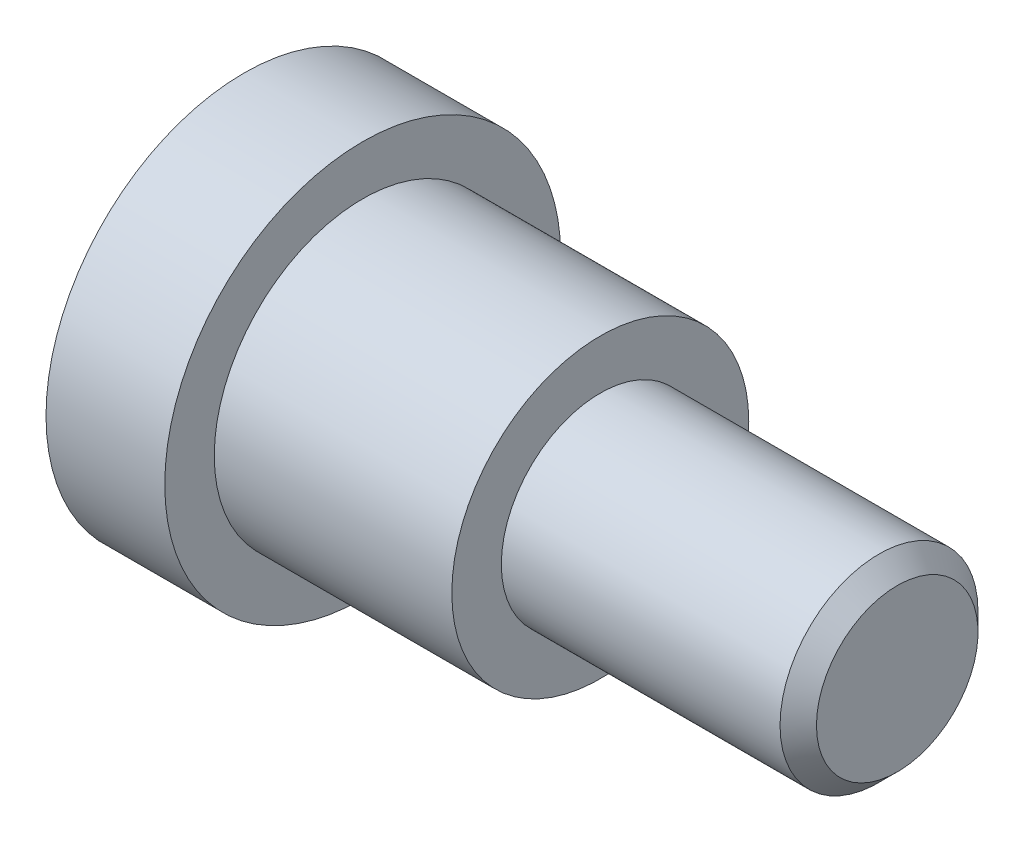
ISO-10303-21;
HEADER;
FILE_DESCRIPTION(('STEP AP214'),'2;1');
FILE_NAME('part.step','',(''),(''),'','','');
FILE_SCHEMA(('AUTOMOTIVE_DESIGN { 1 0 10303 214 1 1 1 1 }'));
ENDSEC;
DATA;
#1=APPLICATION_CONTEXT('core data for automotive mechanical design processes');
#2=APPLICATION_PROTOCOL_DEFINITION('international standard','automotive_design',2000,#1);
#3=PRODUCT_CONTEXT('',#1,'mechanical');
#4=PRODUCT('Part','Part','',(#3));
#5=PRODUCT_RELATED_PRODUCT_CATEGORY('part','',(#4));
#6=PRODUCT_DEFINITION_FORMATION('','',#4);
#7=PRODUCT_DEFINITION_CONTEXT('part definition',#1,'design');
#8=PRODUCT_DEFINITION('design','',#6,#7);
#9=PRODUCT_DEFINITION_SHAPE('','',#8);
#10=(LENGTH_UNIT() NAMED_UNIT(*) SI_UNIT(.MILLI.,.METRE.));
#11=(NAMED_UNIT(*) PLANE_ANGLE_UNIT() SI_UNIT($,.RADIAN.));
#12=(NAMED_UNIT(*) SI_UNIT($,.STERADIAN.) SOLID_ANGLE_UNIT());
#13=UNCERTAINTY_MEASURE_WITH_UNIT(LENGTH_MEASURE(1.E-05),#10,'distance_accuracy_value','');
#14=(GEOMETRIC_REPRESENTATION_CONTEXT(3) GLOBAL_UNCERTAINTY_ASSIGNED_CONTEXT((#13)) GLOBAL_UNIT_ASSIGNED_CONTEXT((#10,
#11,#12)) REPRESENTATION_CONTEXT('',''));
#15=CARTESIAN_POINT('',(0.,0.,0.));
#16=DIRECTION('',(0.,0.,1.));
#17=DIRECTION('',(1.,0.,0.));
#18=AXIS2_PLACEMENT_3D('',#15,#16,#17);
#19=CARTESIAN_POINT('',(27.,2.04,0.));
#20=DIRECTION('',(1.,0.,0.));
#21=DIRECTION('',(0.,0.,-1.));
#22=AXIS2_PLACEMENT_3D('',#19,#20,#21);
#23=PLANE('',#22);
#24=CARTESIAN_POINT('',(26.9999999999868,0.,0.));
#25=DIRECTION('',(-1.,0.,0.));
#26=DIRECTION('',(0.,0.,1.));
#27=AXIS2_PLACEMENT_3D('',#24,#25,#26);
#28=CIRCLE('',#27,4.07999999998765);
#29=CARTESIAN_POINT('',(26.9999999999868,0.,4.07999999998765));
#30=VERTEX_POINT('',#29);
#31=EDGE_CURVE('E20',#30,#30,#28,.T.);
#32=ORIENTED_EDGE('',*,*,#31,.F.);
#33=EDGE_LOOP('',(#32));
#34=FACE_BOUND('',#33,.T.);
#35=ADVANCED_FACE('F17',(#34),#23,.T.);
#36=CARTESIAN_POINT('',(26.0800000001495,0.,0.));
#37=DIRECTION('',(-1.,0.,0.));
#38=DIRECTION('',(0.,0.,1.));
#39=AXIS2_PLACEMENT_3D('',#36,#37,#38);
#40=CONICAL_SURFACE('',#39,4.99999999988177,0.785398163428342);
#41=CARTESIAN_POINT('',(26.08,0.,0.));
#42=DIRECTION('',(1.,0.,0.));
#43=DIRECTION('',(0.,0.,-1.));
#44=AXIS2_PLACEMENT_3D('',#41,#42,#43);
#45=CIRCLE('',#44,5.);
#46=CARTESIAN_POINT('',(26.08,0.,-5.));
#47=VERTEX_POINT('',#46);
#48=EDGE_CURVE('E160',#47,#47,#45,.F.);
#49=ORIENTED_EDGE('',*,*,#48,.F.);
#50=EDGE_LOOP('',(#49));
#51=FACE_BOUND('',#50,.T.);
#52=ORIENTED_EDGE('',*,*,#31,.T.);
#53=EDGE_LOOP('',(#52));
#54=FACE_BOUND('',#53,.T.);
#55=ADVANCED_FACE('F318',(#51,#54),#40,.T.);
#56=CARTESIAN_POINT('',(-1.5,0.,0.));
#57=DIRECTION('',(1.,0.,0.));
#58=DIRECTION('',(0.,0.,-1.));
#59=AXIS2_PLACEMENT_3D('',#56,#57,#58);
#60=PLANE('',#59);
#61=DIRECTION('',(0.,1.,0.));
#62=VECTOR('',#61,1.);
#63=CARTESIAN_POINT('',(-1.5,0.,-3.));
#64=LINE('',#63,#62);
#65=CARTESIAN_POINT('',(-1.5,-1.73205080756888,-3.));
#66=VERTEX_POINT('',#65);
#67=CARTESIAN_POINT('',(-1.49999999998226,0.,-2.99999999999295));
#68=VERTEX_POINT('',#67);
#69=EDGE_CURVE('E89',#66,#68,#64,.T.);
#70=ORIENTED_EDGE('',*,*,#69,.F.);
#71=DIRECTION('',(0.,0.500000000000001,-0.866025403784438));
#72=VECTOR('',#71,1.);
#73=CARTESIAN_POINT('',(-1.5,-2.59807621135332,-1.5));
#74=LINE('',#73,#72);
#75=CARTESIAN_POINT('',(-1.49999999998226,-2.59807621134721,-1.49999999999647));
#76=VERTEX_POINT('',#75);
#77=EDGE_CURVE('E111',#76,#66,#74,.T.);
#78=ORIENTED_EDGE('',*,*,#77,.F.);
#79=CARTESIAN_POINT('',(-1.49999999996453,0.,0.));
#80=DIRECTION('',(-1.,0.,0.));
#81=DIRECTION('',(0.,0.,1.));
#82=AXIS2_PLACEMENT_3D('',#79,#80,#81);
#83=CIRCLE('',#82,2.9999999999859);
#84=EDGE_CURVE('E118',#76,#68,#83,.F.);
#85=ORIENTED_EDGE('',*,*,#84,.T.);
#86=EDGE_LOOP('',(#70,#78,#85));
#87=FACE_BOUND('',#86,.T.);
#88=ADVANCED_FACE('F117',(#87),#60,.F.);
#89=CARTESIAN_POINT('',(-1.5,0.,0.));
#90=DIRECTION('',(1.,0.,0.));
#91=DIRECTION('',(0.,0.,-1.));
#92=AXIS2_PLACEMENT_3D('',#89,#90,#91);
#93=PLANE('',#92);
#94=DIRECTION('',(0.,0.500000000000001,0.866025403784438));
#95=VECTOR('',#94,1.);
#96=CARTESIAN_POINT('',(-1.5,1.73205080756888,-3.));
#97=LINE('',#96,#95);
#98=CARTESIAN_POINT('',(-1.5,1.73205080756888,-3.));
#99=VERTEX_POINT('',#98);
#100=CARTESIAN_POINT('',(-1.49999999998226,2.59807621134721,-1.49999999999647));
#101=VERTEX_POINT('',#100);
#102=EDGE_CURVE('E163',#99,#101,#97,.T.);
#103=ORIENTED_EDGE('',*,*,#102,.F.);
#104=DIRECTION('',(0.,1.,0.));
#105=VECTOR('',#104,1.);
#106=CARTESIAN_POINT('',(-1.5,0.,-3.));
#107=LINE('',#106,#105);
#108=EDGE_CURVE('E174',#68,#99,#107,.T.);
#109=ORIENTED_EDGE('',*,*,#108,.F.);
#110=CARTESIAN_POINT('',(-1.49999999996453,0.,0.));
#111=DIRECTION('',(-1.,0.,0.));
#112=DIRECTION('',(0.,0.,1.));
#113=AXIS2_PLACEMENT_3D('',#110,#111,#112);
#114=CIRCLE('',#113,2.9999999999859);
#115=EDGE_CURVE('E125',#68,#101,#114,.F.);
#116=ORIENTED_EDGE('',*,*,#115,.T.);
#117=EDGE_LOOP('',(#103,#109,#116));
#118=FACE_BOUND('',#117,.T.);
#119=ADVANCED_FACE('F312',(#118),#93,.F.);
#120=CARTESIAN_POINT('',(19.04,0.,0.));
#121=DIRECTION('',(1.,0.,0.));
#122=DIRECTION('',(0.,0.,-1.));
#123=AXIS2_PLACEMENT_3D('',#120,#121,#122);
#124=CYLINDRICAL_SURFACE('',#123,5.);
#125=CARTESIAN_POINT('',(12.,0.,0.));
#126=DIRECTION('',(1.,0.,0.));
#127=DIRECTION('',(0.,0.,-1.));
#128=AXIS2_PLACEMENT_3D('',#125,#126,#127);
#129=CIRCLE('',#128,5.);
#130=CARTESIAN_POINT('',(12.,0.,-5.));
#131=VERTEX_POINT('',#130);
#132=EDGE_CURVE('E127',#131,#131,#129,.F.);
#133=ORIENTED_EDGE('',*,*,#132,.F.);
#134=EDGE_LOOP('',(#133));
#135=FACE_BOUND('',#134,.T.);
#136=ORIENTED_EDGE('',*,*,#48,.T.);
#137=EDGE_LOOP('',(#136));
#138=FACE_BOUND('',#137,.T.);
#139=ADVANCED_FACE('F309',(#135,#138),#124,.T.);
#140=CARTESIAN_POINT('',(-1.5,0.,0.));
#141=DIRECTION('',(1.,0.,0.));
#142=DIRECTION('',(0.,0.,-1.));
#143=AXIS2_PLACEMENT_3D('',#140,#141,#142);
#144=PLANE('',#143);
#145=DIRECTION('',(0.,1.,0.));
#146=VECTOR('',#145,1.);
#147=CARTESIAN_POINT('',(-1.5,0.,3.));
#148=LINE('',#147,#146);
#149=CARTESIAN_POINT('',(-1.5,1.73205080756888,3.));
#150=VERTEX_POINT('',#149);
#151=CARTESIAN_POINT('',(-1.49999999998226,0.,2.99999999999295));
#152=VERTEX_POINT('',#151);
#153=EDGE_CURVE('E126',#150,#152,#148,.F.);
#154=ORIENTED_EDGE('',*,*,#153,.F.);
#155=DIRECTION('',(0.,-0.500000000000001,0.866025403784438));
#156=VECTOR('',#155,1.);
#157=CARTESIAN_POINT('',(-1.5,2.59807621135332,1.5));
#158=LINE('',#157,#156);
#159=CARTESIAN_POINT('',(-1.49999999998226,2.59807621134721,1.49999999999647));
#160=VERTEX_POINT('',#159);
#161=EDGE_CURVE('E129',#160,#150,#158,.T.);
#162=ORIENTED_EDGE('',*,*,#161,.F.);
#163=CARTESIAN_POINT('',(-1.49999999996453,0.,0.));
#164=DIRECTION('',(-1.,0.,0.));
#165=DIRECTION('',(0.,0.,1.));
#166=AXIS2_PLACEMENT_3D('',#163,#164,#165);
#167=CIRCLE('',#166,2.9999999999859);
#168=EDGE_CURVE('E105',#160,#152,#167,.F.);
#169=ORIENTED_EDGE('',*,*,#168,.T.);
#170=EDGE_LOOP('',(#154,#162,#169));
#171=FACE_BOUND('',#170,.T.);
#172=ADVANCED_FACE('F243',(#171),#144,.F.);
#173=CARTESIAN_POINT('',(12.,3.75,0.));
#174=DIRECTION('',(1.,0.,0.));
#175=DIRECTION('',(0.,0.,-1.));
#176=AXIS2_PLACEMENT_3D('',#173,#174,#175);
#177=PLANE('',#176);
#178=CARTESIAN_POINT('',(12.,0.,0.));
#179=DIRECTION('',(1.,0.,0.));
#180=DIRECTION('',(0.,0.,-1.));
#181=AXIS2_PLACEMENT_3D('',#178,#179,#180);
#182=CIRCLE('',#181,7.5);
#183=CARTESIAN_POINT('',(12.,0.,-7.5));
#184=VERTEX_POINT('',#183);
#185=EDGE_CURVE('E104',#184,#184,#182,.F.);
#186=ORIENTED_EDGE('',*,*,#185,.F.);
#187=EDGE_LOOP('',(#186));
#188=FACE_BOUND('',#187,.T.);
#189=ORIENTED_EDGE('',*,*,#132,.T.);
#190=EDGE_LOOP('',(#189));
#191=FACE_BOUND('',#190,.T.);
#192=ADVANCED_FACE('F303',(#188,#191),#177,.T.);
#193=CARTESIAN_POINT('',(-1.49999999996453,0.,0.));
#194=DIRECTION('',(-1.,0.,0.));
#195=DIRECTION('',(0.,0.,1.));
#196=AXIS2_PLACEMENT_3D('',#193,#194,#195);
#197=CONICAL_SURFACE('',#196,2.9999999999859,1.04719755119645);
#198=CARTESIAN_POINT('',(-1.49999999996453,0.,0.));
#199=DIRECTION('',(-1.,0.,0.));
#200=DIRECTION('',(0.,0.,1.));
#201=AXIS2_PLACEMENT_3D('',#198,#199,#200);
#202=CIRCLE('',#201,2.9999999999859);
#203=EDGE_CURVE('E134',#101,#160,#202,.F.);
#204=ORIENTED_EDGE('',*,*,#203,.F.);
#205=ORIENTED_EDGE('',*,*,#115,.F.);
#206=ORIENTED_EDGE('',*,*,#84,.F.);
#207=CARTESIAN_POINT('',(-1.49999999996453,0.,0.));
#208=DIRECTION('',(-1.,0.,0.));
#209=DIRECTION('',(0.,0.,1.));
#210=AXIS2_PLACEMENT_3D('',#207,#208,#209);
#211=CIRCLE('',#210,2.9999999999859);
#212=CARTESIAN_POINT('',(-1.49999999998226,-2.59807621134721,1.49999999999647));
#213=VERTEX_POINT('',#212);
#214=EDGE_CURVE('E94',#213,#76,#211,.F.);
#215=ORIENTED_EDGE('',*,*,#214,.F.);
#216=CARTESIAN_POINT('',(-1.49999999996453,0.,0.));
#217=DIRECTION('',(-1.,0.,0.));
#218=DIRECTION('',(0.,0.,1.));
#219=AXIS2_PLACEMENT_3D('',#216,#217,#218);
#220=CIRCLE('',#219,2.9999999999859);
#221=EDGE_CURVE('E140',#213,#152,#220,.T.);
#222=ORIENTED_EDGE('',*,*,#221,.T.);
#223=ORIENTED_EDGE('',*,*,#168,.F.);
#224=EDGE_LOOP('',(#204,#205,#206,#215,#222,#223));
#225=FACE_BOUND('',#224,.T.);
#226=CARTESIAN_POINT('',(0.232050807625228,2.8421709430404E-11,0.));
#227=VERTEX_POINT('',#226);
#228=VERTEX_LOOP('',#227);
#229=FACE_BOUND('',#228,.T.);
#230=ADVANCED_FACE('F122',(#225,#229),#197,.F.);
#231=CARTESIAN_POINT('',(6.,0.,0.));
#232=DIRECTION('',(1.,0.,0.));
#233=DIRECTION('',(0.,0.,-1.));
#234=AXIS2_PLACEMENT_3D('',#231,#232,#233);
#235=CYLINDRICAL_SURFACE('',#234,7.5);
#236=CARTESIAN_POINT('',(0.,0.,0.));
#237=DIRECTION('',(1.,0.,0.));
#238=DIRECTION('',(0.,0.,-1.));
#239=AXIS2_PLACEMENT_3D('',#236,#237,#238);
#240=CIRCLE('',#239,7.5);
#241=CARTESIAN_POINT('',(0.,0.,-7.5));
#242=VERTEX_POINT('',#241);
#243=EDGE_CURVE('E142',#242,#242,#240,.F.);
#244=ORIENTED_EDGE('',*,*,#243,.F.);
#245=EDGE_LOOP('',(#244));
#246=FACE_BOUND('',#245,.T.);
#247=ORIENTED_EDGE('',*,*,#185,.T.);
#248=EDGE_LOOP('',(#247));
#249=FACE_BOUND('',#248,.T.);
#250=ADVANCED_FACE('F297',(#246,#249),#235,.T.);
#251=CARTESIAN_POINT('',(-1.5,0.,0.));
#252=DIRECTION('',(1.,0.,0.));
#253=DIRECTION('',(0.,0.,-1.));
#254=AXIS2_PLACEMENT_3D('',#251,#252,#253);
#255=PLANE('',#254);
#256=DIRECTION('',(0.,-0.5,-0.866025403784439));
#257=VECTOR('',#256,1.);
#258=CARTESIAN_POINT('',(-1.5,-3.46410161513775,0.));
#259=LINE('',#258,#257);
#260=CARTESIAN_POINT('',(-1.5,-1.73205080756888,3.));
#261=VERTEX_POINT('',#260);
#262=EDGE_CURVE('E190',#213,#261,#259,.F.);
#263=ORIENTED_EDGE('',*,*,#262,.T.);
#264=DIRECTION('',(0.,1.,0.));
#265=VECTOR('',#264,1.);
#266=CARTESIAN_POINT('',(-1.5,-1.73205080756888,3.));
#267=LINE('',#266,#265);
#268=EDGE_CURVE('E145',#261,#152,#267,.T.);
#269=ORIENTED_EDGE('',*,*,#268,.T.);
#270=ORIENTED_EDGE('',*,*,#221,.F.);
#271=EDGE_LOOP('',(#263,#269,#270));
#272=FACE_BOUND('',#271,.T.);
#273=ADVANCED_FACE('F247',(#272),#255,.F.);
#274=CARTESIAN_POINT('',(-1.5,0.,0.));
#275=DIRECTION('',(1.,0.,0.));
#276=DIRECTION('',(0.,0.,-1.));
#277=AXIS2_PLACEMENT_3D('',#274,#275,#276);
#278=PLANE('',#277);
#279=DIRECTION('',(0.,0.5,-0.866025403784439));
#280=VECTOR('',#279,1.);
#281=CARTESIAN_POINT('',(-1.5,-1.73205080756888,-3.));
#282=LINE('',#281,#280);
#283=CARTESIAN_POINT('',(-1.5,-3.46410161513775,0.));
#284=VERTEX_POINT('',#283);
#285=EDGE_CURVE('E97',#76,#284,#282,.F.);
#286=ORIENTED_EDGE('',*,*,#285,.T.);
#287=DIRECTION('',(0.,-0.5,-0.866025403784439));
#288=VECTOR('',#287,1.);
#289=CARTESIAN_POINT('',(-1.5,-3.46410161513775,0.));
#290=LINE('',#289,#288);
#291=EDGE_CURVE('E99',#284,#213,#290,.F.);
#292=ORIENTED_EDGE('',*,*,#291,.T.);
#293=ORIENTED_EDGE('',*,*,#214,.T.);
#294=EDGE_LOOP('',(#286,#292,#293));
#295=FACE_BOUND('',#294,.T.);
#296=ADVANCED_FACE('F96',(#295),#278,.F.);
#297=CARTESIAN_POINT('',(-1.5,0.,0.));
#298=DIRECTION('',(1.,0.,0.));
#299=DIRECTION('',(0.,0.,-1.));
#300=AXIS2_PLACEMENT_3D('',#297,#298,#299);
#301=PLANE('',#300);
#302=DIRECTION('',(0.,-0.5,0.866025403784439));
#303=VECTOR('',#302,1.);
#304=CARTESIAN_POINT('',(-1.5,1.73205080756888,3.));
#305=LINE('',#304,#303);
#306=CARTESIAN_POINT('',(-1.5,3.46410161513775,0.));
#307=VERTEX_POINT('',#306);
#308=EDGE_CURVE('E168',#160,#307,#305,.F.);
#309=ORIENTED_EDGE('',*,*,#308,.T.);
#310=DIRECTION('',(0.,0.5,0.866025403784439));
#311=VECTOR('',#310,1.);
#312=CARTESIAN_POINT('',(-1.5,3.46410161513775,0.));
#313=LINE('',#312,#311);
#314=EDGE_CURVE('E154',#307,#101,#313,.F.);
#315=ORIENTED_EDGE('',*,*,#314,.T.);
#316=ORIENTED_EDGE('',*,*,#203,.T.);
#317=EDGE_LOOP('',(#309,#315,#316));
#318=FACE_BOUND('',#317,.T.);
#319=ADVANCED_FACE('F281',(#318),#301,.F.);
#320=CARTESIAN_POINT('',(0.,8.75,0.));
#321=DIRECTION('',(1.,0.,0.));
#322=DIRECTION('',(0.,0.,-1.));
#323=AXIS2_PLACEMENT_3D('',#320,#321,#322);
#324=PLANE('',#323);
#325=ORIENTED_EDGE('',*,*,#243,.T.);
#326=EDGE_LOOP('',(#325));
#327=FACE_BOUND('',#326,.T.);
#328=CARTESIAN_POINT('',(0.,0.,0.));
#329=DIRECTION('',(1.,0.,0.));
#330=DIRECTION('',(0.,0.,-1.));
#331=AXIS2_PLACEMENT_3D('',#328,#329,#330);
#332=CIRCLE('',#331,10.);
#333=CARTESIAN_POINT('',(0.,0.,-10.));
#334=VERTEX_POINT('',#333);
#335=EDGE_CURVE('E146',#334,#334,#332,.F.);
#336=ORIENTED_EDGE('',*,*,#335,.F.);
#337=EDGE_LOOP('',(#336));
#338=FACE_BOUND('',#337,.T.);
#339=ADVANCED_FACE('F279',(#327,#338),#324,.T.);
#340=CARTESIAN_POINT('',(-6.,-1.73205080756888,3.));
#341=DIRECTION('',(0.,0.,1.));
#342=DIRECTION('',(1.,0.,0.));
#343=AXIS2_PLACEMENT_3D('',#340,#341,#342);
#344=PLANE('',#343);
#345=DIRECTION('',(1.,0.,0.));
#346=VECTOR('',#345,1.);
#347=CARTESIAN_POINT('',(-6.,1.73205080756888,3.));
#348=LINE('',#347,#346);
#349=CARTESIAN_POINT('',(-6.,1.73205080756888,3.));
#350=VERTEX_POINT('',#349);
#351=EDGE_CURVE('E159',#350,#150,#348,.T.);
#352=ORIENTED_EDGE('',*,*,#351,.T.);
#353=ORIENTED_EDGE('',*,*,#153,.T.);
#354=ORIENTED_EDGE('',*,*,#268,.F.);
#355=DIRECTION('',(1.,0.,0.));
#356=VECTOR('',#355,1.);
#357=CARTESIAN_POINT('',(-6.,-1.73205080756887,3.));
#358=LINE('',#357,#356);
#359=CARTESIAN_POINT('',(-6.,-1.73205080756888,3.));
#360=VERTEX_POINT('',#359);
#361=EDGE_CURVE('E114',#261,#360,#358,.F.);
#362=ORIENTED_EDGE('',*,*,#361,.T.);
#363=DIRECTION('',(0.,1.,0.));
#364=VECTOR('',#363,1.);
#365=CARTESIAN_POINT('',(-6.,5.,3.));
#366=LINE('',#365,#364);
#367=EDGE_CURVE('E148',#350,#360,#366,.F.);
#368=ORIENTED_EDGE('',*,*,#367,.F.);
#369=EDGE_LOOP('',(#352,#353,#354,#362,#368));
#370=FACE_BOUND('',#369,.T.);
#371=ADVANCED_FACE('F240',(#370),#344,.F.);
#372=CARTESIAN_POINT('',(-6.,-3.46410161513775,0.));
#373=DIRECTION('',(0.,-0.866025403784439,0.5));
#374=DIRECTION('',(0.,-0.5,-0.866025403784439));
#375=AXIS2_PLACEMENT_3D('',#372,#373,#374);
#376=PLANE('',#375);
#377=ORIENTED_EDGE('',*,*,#361,.F.);
#378=ORIENTED_EDGE('',*,*,#262,.F.);
#379=ORIENTED_EDGE('',*,*,#291,.F.);
#380=DIRECTION('',(1.,0.,0.));
#381=VECTOR('',#380,1.);
#382=CARTESIAN_POINT('',(-6.,-3.46410161513776,0.));
#383=LINE('',#382,#381);
#384=CARTESIAN_POINT('',(-6.,-3.46410161513775,0.));
#385=VERTEX_POINT('',#384);
#386=EDGE_CURVE('E113',#284,#385,#383,.F.);
#387=ORIENTED_EDGE('',*,*,#386,.T.);
#388=DIRECTION('',(0.,-0.499999999999998,-0.86602540378444));
#389=VECTOR('',#388,1.);
#390=CARTESIAN_POINT('',(-6.,-1.73205080756888,3.));
#391=LINE('',#390,#389);
#392=EDGE_CURVE('E218',#360,#385,#391,.T.);
#393=ORIENTED_EDGE('',*,*,#392,.F.);
#394=EDGE_LOOP('',(#377,#378,#379,#387,#393));
#395=FACE_BOUND('',#394,.T.);
#396=ADVANCED_FACE('F251',(#395),#376,.F.);
#397=CARTESIAN_POINT('',(-6.,-1.73205080756888,-3.));
#398=DIRECTION('',(0.,-0.866025403784439,-0.5));
#399=DIRECTION('',(0.,0.5,-0.866025403784439));
#400=AXIS2_PLACEMENT_3D('',#397,#398,#399);
#401=PLANE('',#400);
#402=ORIENTED_EDGE('',*,*,#386,.F.);
#403=ORIENTED_EDGE('',*,*,#285,.F.);
#404=ORIENTED_EDGE('',*,*,#77,.T.);
#405=DIRECTION('',(-1.,0.,0.));
#406=VECTOR('',#405,1.);
#407=CARTESIAN_POINT('',(-6.,-1.73205080756888,-3.));
#408=LINE('',#407,#406);
#409=CARTESIAN_POINT('',(-6.,-1.73205080756888,-3.));
#410=VERTEX_POINT('',#409);
#411=EDGE_CURVE('E152',#66,#410,#408,.T.);
#412=ORIENTED_EDGE('',*,*,#411,.T.);
#413=DIRECTION('',(0.,0.499999999999998,-0.86602540378444));
#414=VECTOR('',#413,1.);
#415=CARTESIAN_POINT('',(-6.,-3.46410161513775,0.));
#416=LINE('',#415,#414);
#417=EDGE_CURVE('E221',#385,#410,#416,.T.);
#418=ORIENTED_EDGE('',*,*,#417,.F.);
#419=EDGE_LOOP('',(#402,#403,#404,#412,#418));
#420=FACE_BOUND('',#419,.T.);
#421=ADVANCED_FACE('F110',(#420),#401,.F.);
#422=CARTESIAN_POINT('',(-6.,1.73205080756888,-3.));
#423=DIRECTION('',(0.,0.,-1.));
#424=DIRECTION('',(-1.,0.,0.));
#425=AXIS2_PLACEMENT_3D('',#422,#423,#424);
#426=PLANE('',#425);
#427=ORIENTED_EDGE('',*,*,#411,.F.);
#428=ORIENTED_EDGE('',*,*,#69,.T.);
#429=ORIENTED_EDGE('',*,*,#108,.T.);
#430=DIRECTION('',(1.,0.,0.));
#431=VECTOR('',#430,1.);
#432=CARTESIAN_POINT('',(-6.,1.73205080756887,-3.));
#433=LINE('',#432,#431);
#434=CARTESIAN_POINT('',(-6.,1.73205080756888,-3.));
#435=VERTEX_POINT('',#434);
#436=EDGE_CURVE('E157',#99,#435,#433,.F.);
#437=ORIENTED_EDGE('',*,*,#436,.T.);
#438=DIRECTION('',(0.,1.,0.));
#439=VECTOR('',#438,1.);
#440=CARTESIAN_POINT('',(-6.,5.,-3.));
#441=LINE('',#440,#439);
#442=EDGE_CURVE('E224',#410,#435,#441,.T.);
#443=ORIENTED_EDGE('',*,*,#442,.F.);
#444=EDGE_LOOP('',(#427,#428,#429,#437,#443));
#445=FACE_BOUND('',#444,.T.);
#446=ADVANCED_FACE('F253',(#445),#426,.F.);
#447=CARTESIAN_POINT('',(-6.,3.46410161513775,0.));
#448=DIRECTION('',(0.,0.866025403784439,-0.5));
#449=DIRECTION('',(0.,0.5,0.866025403784439));
#450=AXIS2_PLACEMENT_3D('',#447,#448,#449);
#451=PLANE('',#450);
#452=ORIENTED_EDGE('',*,*,#436,.F.);
#453=ORIENTED_EDGE('',*,*,#102,.T.);
#454=ORIENTED_EDGE('',*,*,#314,.F.);
#455=DIRECTION('',(1.,0.,0.));
#456=VECTOR('',#455,1.);
#457=CARTESIAN_POINT('',(-6.,3.46410161513776,0.));
#458=LINE('',#457,#456);
#459=CARTESIAN_POINT('',(-6.,3.46410161513775,0.));
#460=VERTEX_POINT('',#459);
#461=EDGE_CURVE('E35',#307,#460,#458,.F.);
#462=ORIENTED_EDGE('',*,*,#461,.T.);
#463=DIRECTION('',(0.,0.499999999999998,0.86602540378444));
#464=VECTOR('',#463,1.);
#465=CARTESIAN_POINT('',(-6.,1.73205080756888,-3.));
#466=LINE('',#465,#464);
#467=EDGE_CURVE('E227',#435,#460,#466,.T.);
#468=ORIENTED_EDGE('',*,*,#467,.F.);
#469=EDGE_LOOP('',(#452,#453,#454,#462,#468));
#470=FACE_BOUND('',#469,.T.);
#471=ADVANCED_FACE('F256',(#470),#451,.F.);
#472=CARTESIAN_POINT('',(-6.,1.73205080756888,3.));
#473=DIRECTION('',(0.,0.866025403784439,0.5));
#474=DIRECTION('',(0.,-0.5,0.866025403784439));
#475=AXIS2_PLACEMENT_3D('',#472,#473,#474);
#476=PLANE('',#475);
#477=ORIENTED_EDGE('',*,*,#461,.F.);
#478=ORIENTED_EDGE('',*,*,#308,.F.);
#479=ORIENTED_EDGE('',*,*,#161,.T.);
#480=ORIENTED_EDGE('',*,*,#351,.F.);
#481=DIRECTION('',(0.,-0.499999999999998,0.86602540378444));
#482=VECTOR('',#481,1.);
#483=CARTESIAN_POINT('',(-6.,3.46410161513775,0.));
#484=LINE('',#483,#482);
#485=EDGE_CURVE('E26',#460,#350,#484,.T.);
#486=ORIENTED_EDGE('',*,*,#485,.F.);
#487=EDGE_LOOP('',(#477,#478,#479,#480,#486));
#488=FACE_BOUND('',#487,.T.);
#489=ADVANCED_FACE('F235',(#488),#476,.F.);
#490=CARTESIAN_POINT('',(-3.,0.,0.));
#491=DIRECTION('',(1.,0.,0.));
#492=DIRECTION('',(0.,0.,-1.));
#493=AXIS2_PLACEMENT_3D('',#490,#491,#492);
#494=CYLINDRICAL_SURFACE('',#493,10.);
#495=CARTESIAN_POINT('',(-6.,0.,0.));
#496=DIRECTION('',(1.,0.,0.));
#497=DIRECTION('',(0.,0.,-1.));
#498=AXIS2_PLACEMENT_3D('',#495,#496,#497);
#499=CIRCLE('',#498,10.);
#500=CARTESIAN_POINT('',(-6.,0.,-10.));
#501=VERTEX_POINT('',#500);
#502=EDGE_CURVE('E11',#501,#501,#499,.F.);
#503=ORIENTED_EDGE('',*,*,#502,.F.);
#504=EDGE_LOOP('',(#503));
#505=FACE_BOUND('',#504,.T.);
#506=ORIENTED_EDGE('',*,*,#335,.T.);
#507=EDGE_LOOP('',(#506));
#508=FACE_BOUND('',#507,.T.);
#509=ADVANCED_FACE('F264',(#505,#508),#494,.T.);
#510=CARTESIAN_POINT('',(-6.,5.,0.));
#511=DIRECTION('',(-1.,0.,0.));
#512=DIRECTION('',(0.,0.,1.));
#513=AXIS2_PLACEMENT_3D('',#510,#511,#512);
#514=PLANE('',#513);
#515=ORIENTED_EDGE('',*,*,#502,.T.);
#516=EDGE_LOOP('',(#515));
#517=FACE_BOUND('',#516,.T.);
#518=ORIENTED_EDGE('',*,*,#467,.T.);
#519=ORIENTED_EDGE('',*,*,#485,.T.);
#520=ORIENTED_EDGE('',*,*,#367,.T.);
#521=ORIENTED_EDGE('',*,*,#392,.T.);
#522=ORIENTED_EDGE('',*,*,#417,.T.);
#523=ORIENTED_EDGE('',*,*,#442,.T.);
#524=EDGE_LOOP('',(#518,#519,#520,#521,#522,#523));
#525=FACE_BOUND('',#524,.T.);
#526=ADVANCED_FACE('F232',(#517,#525),#514,.T.);
#527=CLOSED_SHELL('',(#35,#55,#88,#119,#139,#172,#192,#230,#250,#273,#296,#319,#339,#371,#396,
#421,#446,#471,#489,#509,#526));
#528=MANIFOLD_SOLID_BREP('B1',#527);
#529=ADVANCED_BREP_SHAPE_REPRESENTATION('',(#18,#528),#14);
#530=SHAPE_DEFINITION_REPRESENTATION(#9,#529);
ENDSEC;
END-ISO-10303-21;
